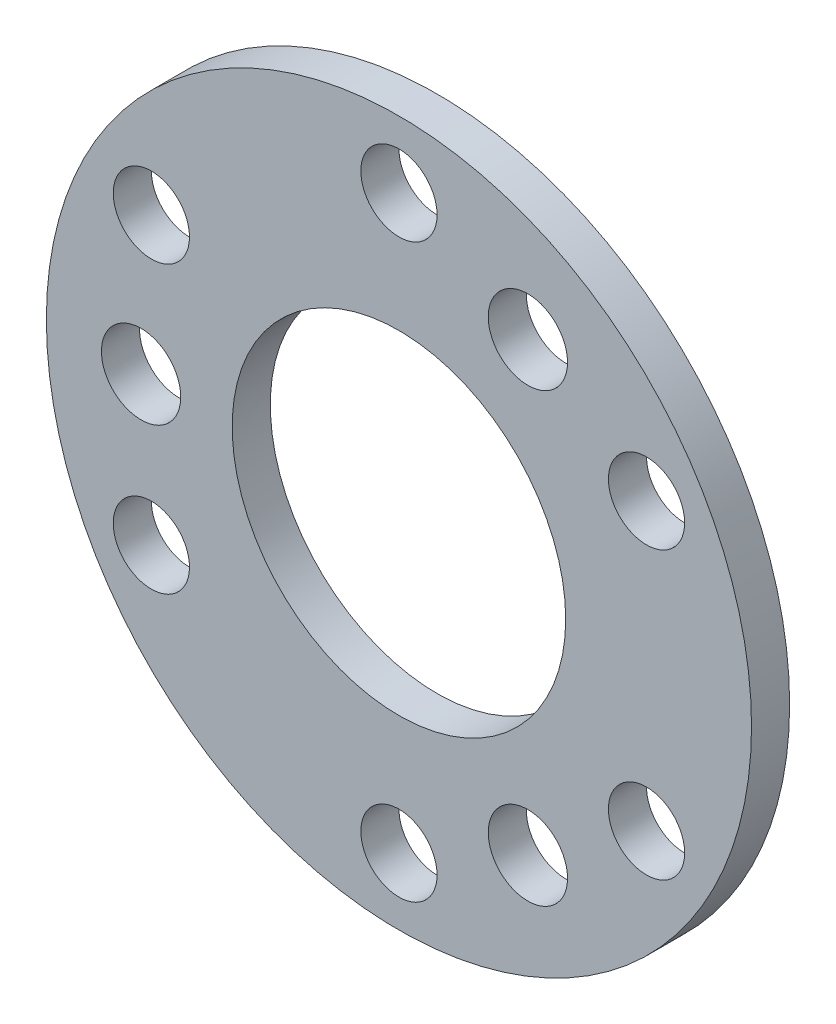
ISO-10303-21;
HEADER;
FILE_DESCRIPTION(('STEP AP214'),'2;1');
FILE_NAME('part.step','',(''),(''),'','','');
FILE_SCHEMA(('AUTOMOTIVE_DESIGN { 1 0 10303 214 1 1 1 1 }'));
ENDSEC;
DATA;
#1=APPLICATION_CONTEXT('core data for automotive mechanical design processes');
#2=APPLICATION_PROTOCOL_DEFINITION('international standard','automotive_design',2000,#1);
#3=PRODUCT_CONTEXT('',#1,'mechanical');
#4=PRODUCT('Part','Part','',(#3));
#5=PRODUCT_RELATED_PRODUCT_CATEGORY('part','',(#4));
#6=PRODUCT_DEFINITION_FORMATION('','',#4);
#7=PRODUCT_DEFINITION_CONTEXT('part definition',#1,'design');
#8=PRODUCT_DEFINITION('design','',#6,#7);
#9=PRODUCT_DEFINITION_SHAPE('','',#8);
#10=(LENGTH_UNIT() NAMED_UNIT(*) SI_UNIT(.MILLI.,.METRE.));
#11=(NAMED_UNIT(*) PLANE_ANGLE_UNIT() SI_UNIT($,.RADIAN.));
#12=(NAMED_UNIT(*) SI_UNIT($,.STERADIAN.) SOLID_ANGLE_UNIT());
#13=UNCERTAINTY_MEASURE_WITH_UNIT(LENGTH_MEASURE(1.E-05),#10,'distance_accuracy_value','');
#14=(GEOMETRIC_REPRESENTATION_CONTEXT(3) GLOBAL_UNCERTAINTY_ASSIGNED_CONTEXT((#13)) GLOBAL_UNIT_ASSIGNED_CONTEXT((#10,
#11,#12)) REPRESENTATION_CONTEXT('',''));
#15=CARTESIAN_POINT('',(0.,0.,0.));
#16=DIRECTION('',(0.,0.,1.));
#17=DIRECTION('',(1.,0.,0.));
#18=AXIS2_PLACEMENT_3D('',#15,#16,#17);
#19=CARTESIAN_POINT('',(-0.985220570796085,0.129022057079611,2.));
#20=DIRECTION('',(0.,0.,1.));
#21=DIRECTION('',(1.,0.,0.));
#22=AXIS2_PLACEMENT_3D('',#19,#20,#21);
#23=PLANE('',#22);
#24=CARTESIAN_POINT('',(5.77977942920397,11.846345770283,2.));
#25=DIRECTION('',(0.,0.,1.));
#26=DIRECTION('',(1.,0.,0.));
#27=AXIS2_PLACEMENT_3D('',#24,#25,#26);
#28=CIRCLE('',#27,2.08);
#29=CARTESIAN_POINT('',(7.85977942920397,11.846345770283,2.));
#30=VERTEX_POINT('',#29);
#31=EDGE_CURVE('E89',#30,#30,#28,.T.);
#32=ORIENTED_EDGE('',*,*,#31,.F.);
#33=EDGE_LOOP('',(#32));
#34=FACE_BOUND('',#33,.T.);
#35=CARTESIAN_POINT('',(12.0051604859704,-7.37097794292054,2.));
#36=DIRECTION('',(0.,0.,1.));
#37=DIRECTION('',(1.,0.,0.));
#38=AXIS2_PLACEMENT_3D('',#35,#36,#37);
#39=CIRCLE('',#38,2.);
#40=CARTESIAN_POINT('',(14.0051604859704,-7.37097794292054,2.));
#41=VERTEX_POINT('',#40);
#42=EDGE_CURVE('E77',#41,#41,#39,.T.);
#43=ORIENTED_EDGE('',*,*,#42,.F.);
#44=EDGE_LOOP('',(#43));
#45=FACE_BOUND('',#44,.T.);
#46=CARTESIAN_POINT('',(-0.98522057079598,15.1290220570796,2.));
#47=DIRECTION('',(0.,0.,1.));
#48=DIRECTION('',(1.,0.,0.));
#49=AXIS2_PLACEMENT_3D('',#46,#47,#48);
#50=CIRCLE('',#49,2.);
#51=CARTESIAN_POINT('',(1.01477942920402,15.1290220570796,2.));
#52=VERTEX_POINT('',#51);
#53=EDGE_CURVE('E65',#52,#52,#50,.T.);
#54=ORIENTED_EDGE('',*,*,#53,.F.);
#55=EDGE_LOOP('',(#54));
#56=FACE_BOUND('',#55,.T.);
#57=CARTESIAN_POINT('',(-13.9756016275627,-7.37097794292036,2.));
#58=DIRECTION('',(0.,0.,1.));
#59=DIRECTION('',(1.,0.,0.));
#60=AXIS2_PLACEMENT_3D('',#57,#58,#59);
#61=CIRCLE('',#60,2.);
#62=CARTESIAN_POINT('',(-11.9756016275627,-7.37097794292036,2.));
#63=VERTEX_POINT('',#62);
#64=EDGE_CURVE('E53',#63,#63,#61,.T.);
#65=ORIENTED_EDGE('',*,*,#64,.F.);
#66=EDGE_LOOP('',(#65));
#67=FACE_BOUND('',#66,.T.);
#68=CARTESIAN_POINT('',(-0.985220570796085,-14.8709779429204,2.));
#69=DIRECTION('',(0.,0.,1.));
#70=DIRECTION('',(1.,0.,0.));
#71=AXIS2_PLACEMENT_3D('',#68,#69,#70);
#72=CIRCLE('',#71,2.);
#73=CARTESIAN_POINT('',(1.01477942920391,-14.8709779429204,2.));
#74=VERTEX_POINT('',#73);
#75=EDGE_CURVE('E42',#74,#74,#72,.T.);
#76=ORIENTED_EDGE('',*,*,#75,.F.);
#77=EDGE_LOOP('',(#76));
#78=FACE_BOUND('',#77,.T.);
#79=CARTESIAN_POINT('',(-0.985220570796085,0.129022057079611,2.));
#80=DIRECTION('',(0.,0.,1.));
#81=DIRECTION('',(1.,0.,0.));
#82=AXIS2_PLACEMENT_3D('',#79,#80,#81);
#83=CIRCLE('',#82,18.5);
#84=CARTESIAN_POINT('',(17.5147794292039,0.129022057079611,2.));
#85=VERTEX_POINT('',#84);
#86=EDGE_CURVE('E10',#85,#85,#83,.T.);
#87=ORIENTED_EDGE('',*,*,#86,.T.);
#88=EDGE_LOOP('',(#87));
#89=FACE_BOUND('',#88,.T.);
#90=CARTESIAN_POINT('',(-14.5152205707961,0.129022057079611,2.));
#91=DIRECTION('',(0.,0.,1.));
#92=DIRECTION('',(1.,0.,0.));
#93=AXIS2_PLACEMENT_3D('',#90,#91,#92);
#94=CIRCLE('',#93,2.08);
#95=CARTESIAN_POINT('',(-12.4352205707961,0.129022057079611,2.));
#96=VERTEX_POINT('',#95);
#97=EDGE_CURVE('E47',#96,#96,#94,.T.);
#98=ORIENTED_EDGE('',*,*,#97,.F.);
#99=EDGE_LOOP('',(#98));
#100=FACE_BOUND('',#99,.T.);
#101=CARTESIAN_POINT('',(-13.9756016275626,7.62902205707967,2.));
#102=DIRECTION('',(0.,0.,1.));
#103=DIRECTION('',(1.,0.,0.));
#104=AXIS2_PLACEMENT_3D('',#101,#102,#103);
#105=CIRCLE('',#104,2.);
#106=CARTESIAN_POINT('',(-11.9756016275626,7.62902205707967,2.));
#107=VERTEX_POINT('',#106);
#108=EDGE_CURVE('E59',#107,#107,#105,.T.);
#109=ORIENTED_EDGE('',*,*,#108,.F.);
#110=EDGE_LOOP('',(#109));
#111=FACE_BOUND('',#110,.T.);
#112=CARTESIAN_POINT('',(12.0051604859706,7.62902205707949,2.));
#113=DIRECTION('',(0.,0.,1.));
#114=DIRECTION('',(1.,0.,0.));
#115=AXIS2_PLACEMENT_3D('',#112,#113,#114);
#116=CIRCLE('',#115,2.);
#117=CARTESIAN_POINT('',(14.0051604859706,7.62902205707949,2.));
#118=VERTEX_POINT('',#117);
#119=EDGE_CURVE('E71',#118,#118,#116,.T.);
#120=ORIENTED_EDGE('',*,*,#119,.F.);
#121=EDGE_LOOP('',(#120));
#122=FACE_BOUND('',#121,.T.);
#123=CARTESIAN_POINT('',(-0.985220570796085,0.129022057079611,2.));
#124=DIRECTION('',(0.,0.,1.));
#125=DIRECTION('',(1.,0.,0.));
#126=AXIS2_PLACEMENT_3D('',#123,#124,#125);
#127=CIRCLE('',#126,8.75);
#128=CARTESIAN_POINT('',(7.76477942920392,0.129022057079611,2.));
#129=VERTEX_POINT('',#128);
#130=EDGE_CURVE('E83',#129,#129,#127,.T.);
#131=ORIENTED_EDGE('',*,*,#130,.F.);
#132=EDGE_LOOP('',(#131));
#133=FACE_BOUND('',#132,.T.);
#134=CARTESIAN_POINT('',(5.77977942920381,-11.5883016561239,2.));
#135=DIRECTION('',(0.,0.,1.));
#136=DIRECTION('',(1.,0.,0.));
#137=AXIS2_PLACEMENT_3D('',#134,#135,#136);
#138=CIRCLE('',#137,2.08);
#139=CARTESIAN_POINT('',(7.85977942920381,-11.5883016561239,2.));
#140=VERTEX_POINT('',#139);
#141=EDGE_CURVE('E95',#140,#140,#138,.T.);
#142=ORIENTED_EDGE('',*,*,#141,.F.);
#143=EDGE_LOOP('',(#142));
#144=FACE_BOUND('',#143,.T.);
#145=ADVANCED_FACE('F31',(#34,#45,#56,#67,#78,#89,#100,#111,#122,#133,#144),#23,.T.);
#146=CARTESIAN_POINT('',(-0.985220570796085,0.129022057079611,0.));
#147=DIRECTION('',(0.,0.,1.));
#148=DIRECTION('',(1.,0.,0.));
#149=AXIS2_PLACEMENT_3D('',#146,#147,#148);
#150=PLANE('',#149);
#151=CARTESIAN_POINT('',(-0.985220570796085,0.129022057079611,0.));
#152=DIRECTION('',(0.,0.,1.));
#153=DIRECTION('',(1.,0.,0.));
#154=AXIS2_PLACEMENT_3D('',#151,#152,#153);
#155=CIRCLE('',#154,18.5);
#156=CARTESIAN_POINT('',(17.5147794292039,0.129022057079611,0.));
#157=VERTEX_POINT('',#156);
#158=EDGE_CURVE('E35',#157,#157,#155,.T.);
#159=ORIENTED_EDGE('',*,*,#158,.F.);
#160=EDGE_LOOP('',(#159));
#161=FACE_BOUND('',#160,.T.);
#162=CARTESIAN_POINT('',(-0.985220570796085,-14.8709779429204,0.));
#163=DIRECTION('',(0.,0.,1.));
#164=DIRECTION('',(1.,0.,0.));
#165=AXIS2_PLACEMENT_3D('',#162,#163,#164);
#166=CIRCLE('',#165,2.);
#167=CARTESIAN_POINT('',(1.01477942920391,-14.8709779429204,0.));
#168=VERTEX_POINT('',#167);
#169=EDGE_CURVE('E44',#168,#168,#166,.T.);
#170=ORIENTED_EDGE('',*,*,#169,.T.);
#171=EDGE_LOOP('',(#170));
#172=FACE_BOUND('',#171,.T.);
#173=CARTESIAN_POINT('',(-14.5152205707961,0.129022057079611,0.));
#174=DIRECTION('',(0.,0.,1.));
#175=DIRECTION('',(1.,0.,0.));
#176=AXIS2_PLACEMENT_3D('',#173,#174,#175);
#177=CIRCLE('',#176,2.08);
#178=CARTESIAN_POINT('',(-12.4352205707961,0.129022057079611,0.));
#179=VERTEX_POINT('',#178);
#180=EDGE_CURVE('E50',#179,#179,#177,.T.);
#181=ORIENTED_EDGE('',*,*,#180,.T.);
#182=EDGE_LOOP('',(#181));
#183=FACE_BOUND('',#182,.T.);
#184=CARTESIAN_POINT('',(-13.9756016275627,-7.37097794292036,0.));
#185=DIRECTION('',(0.,0.,1.));
#186=DIRECTION('',(1.,0.,0.));
#187=AXIS2_PLACEMENT_3D('',#184,#185,#186);
#188=CIRCLE('',#187,2.);
#189=CARTESIAN_POINT('',(-11.9756016275627,-7.37097794292036,0.));
#190=VERTEX_POINT('',#189);
#191=EDGE_CURVE('E56',#190,#190,#188,.T.);
#192=ORIENTED_EDGE('',*,*,#191,.T.);
#193=EDGE_LOOP('',(#192));
#194=FACE_BOUND('',#193,.T.);
#195=CARTESIAN_POINT('',(-13.9756016275626,7.62902205707967,0.));
#196=DIRECTION('',(0.,0.,1.));
#197=DIRECTION('',(1.,0.,0.));
#198=AXIS2_PLACEMENT_3D('',#195,#196,#197);
#199=CIRCLE('',#198,2.);
#200=CARTESIAN_POINT('',(-11.9756016275626,7.62902205707967,0.));
#201=VERTEX_POINT('',#200);
#202=EDGE_CURVE('E62',#201,#201,#199,.T.);
#203=ORIENTED_EDGE('',*,*,#202,.T.);
#204=EDGE_LOOP('',(#203));
#205=FACE_BOUND('',#204,.T.);
#206=CARTESIAN_POINT('',(-0.98522057079598,15.1290220570796,0.));
#207=DIRECTION('',(0.,0.,1.));
#208=DIRECTION('',(1.,0.,0.));
#209=AXIS2_PLACEMENT_3D('',#206,#207,#208);
#210=CIRCLE('',#209,2.);
#211=CARTESIAN_POINT('',(1.01477942920402,15.1290220570796,0.));
#212=VERTEX_POINT('',#211);
#213=EDGE_CURVE('E68',#212,#212,#210,.T.);
#214=ORIENTED_EDGE('',*,*,#213,.T.);
#215=EDGE_LOOP('',(#214));
#216=FACE_BOUND('',#215,.T.);
#217=CARTESIAN_POINT('',(12.0051604859706,7.62902205707949,0.));
#218=DIRECTION('',(0.,0.,1.));
#219=DIRECTION('',(1.,0.,0.));
#220=AXIS2_PLACEMENT_3D('',#217,#218,#219);
#221=CIRCLE('',#220,2.);
#222=CARTESIAN_POINT('',(14.0051604859706,7.62902205707949,0.));
#223=VERTEX_POINT('',#222);
#224=EDGE_CURVE('E74',#223,#223,#221,.T.);
#225=ORIENTED_EDGE('',*,*,#224,.T.);
#226=EDGE_LOOP('',(#225));
#227=FACE_BOUND('',#226,.T.);
#228=CARTESIAN_POINT('',(12.0051604859704,-7.37097794292054,0.));
#229=DIRECTION('',(0.,0.,1.));
#230=DIRECTION('',(1.,0.,0.));
#231=AXIS2_PLACEMENT_3D('',#228,#229,#230);
#232=CIRCLE('',#231,2.);
#233=CARTESIAN_POINT('',(14.0051604859704,-7.37097794292054,0.));
#234=VERTEX_POINT('',#233);
#235=EDGE_CURVE('E80',#234,#234,#232,.T.);
#236=ORIENTED_EDGE('',*,*,#235,.T.);
#237=EDGE_LOOP('',(#236));
#238=FACE_BOUND('',#237,.T.);
#239=CARTESIAN_POINT('',(-0.985220570796085,0.129022057079611,0.));
#240=DIRECTION('',(0.,0.,1.));
#241=DIRECTION('',(1.,0.,0.));
#242=AXIS2_PLACEMENT_3D('',#239,#240,#241);
#243=CIRCLE('',#242,8.75);
#244=CARTESIAN_POINT('',(7.76477942920392,0.129022057079611,0.));
#245=VERTEX_POINT('',#244);
#246=EDGE_CURVE('E86',#245,#245,#243,.T.);
#247=ORIENTED_EDGE('',*,*,#246,.T.);
#248=EDGE_LOOP('',(#247));
#249=FACE_BOUND('',#248,.T.);
#250=CARTESIAN_POINT('',(5.77977942920397,11.846345770283,0.));
#251=DIRECTION('',(0.,0.,1.));
#252=DIRECTION('',(1.,0.,0.));
#253=AXIS2_PLACEMENT_3D('',#250,#251,#252);
#254=CIRCLE('',#253,2.08);
#255=CARTESIAN_POINT('',(7.85977942920397,11.846345770283,0.));
#256=VERTEX_POINT('',#255);
#257=EDGE_CURVE('E92',#256,#256,#254,.T.);
#258=ORIENTED_EDGE('',*,*,#257,.T.);
#259=EDGE_LOOP('',(#258));
#260=FACE_BOUND('',#259,.T.);
#261=CARTESIAN_POINT('',(5.77977942920381,-11.5883016561239,0.));
#262=DIRECTION('',(0.,0.,1.));
#263=DIRECTION('',(1.,0.,0.));
#264=AXIS2_PLACEMENT_3D('',#261,#262,#263);
#265=CIRCLE('',#264,2.08);
#266=CARTESIAN_POINT('',(7.85977942920381,-11.5883016561239,0.));
#267=VERTEX_POINT('',#266);
#268=EDGE_CURVE('E98',#267,#267,#265,.T.);
#269=ORIENTED_EDGE('',*,*,#268,.T.);
#270=EDGE_LOOP('',(#269));
#271=FACE_BOUND('',#270,.T.);
#272=ADVANCED_FACE('F108',(#161,#172,#183,#194,#205,#216,#227,#238,#249,#260,#271),#150,.F.);
#273=CARTESIAN_POINT('',(-0.985220570796085,0.129022057079611,2.));
#274=DIRECTION('',(0.,0.,-1.));
#275=DIRECTION('',(-1.,0.,0.));
#276=AXIS2_PLACEMENT_3D('',#273,#274,#275);
#277=CYLINDRICAL_SURFACE('',#276,18.5);
#278=ORIENTED_EDGE('',*,*,#86,.F.);
#279=EDGE_LOOP('',(#278));
#280=FACE_BOUND('',#279,.T.);
#281=ORIENTED_EDGE('',*,*,#158,.T.);
#282=EDGE_LOOP('',(#281));
#283=FACE_BOUND('',#282,.T.);
#284=ADVANCED_FACE('F33',(#280,#283),#277,.T.);
#285=CARTESIAN_POINT('',(-0.985220570796085,-14.8709779429204,2.));
#286=DIRECTION('',(0.,0.,-1.));
#287=DIRECTION('',(-1.,0.,0.));
#288=AXIS2_PLACEMENT_3D('',#285,#286,#287);
#289=CYLINDRICAL_SURFACE('',#288,2.);
#290=ORIENTED_EDGE('',*,*,#75,.T.);
#291=EDGE_LOOP('',(#290));
#292=FACE_BOUND('',#291,.T.);
#293=ORIENTED_EDGE('',*,*,#169,.F.);
#294=EDGE_LOOP('',(#293));
#295=FACE_BOUND('',#294,.T.);
#296=ADVANCED_FACE('F118',(#292,#295),#289,.F.);
#297=CARTESIAN_POINT('',(-14.5152205707961,0.129022057079611,2.));
#298=DIRECTION('',(0.,0.,-1.));
#299=DIRECTION('',(-1.,0.,0.));
#300=AXIS2_PLACEMENT_3D('',#297,#298,#299);
#301=CYLINDRICAL_SURFACE('',#300,2.08);
#302=ORIENTED_EDGE('',*,*,#97,.T.);
#303=EDGE_LOOP('',(#302));
#304=FACE_BOUND('',#303,.T.);
#305=ORIENTED_EDGE('',*,*,#180,.F.);
#306=EDGE_LOOP('',(#305));
#307=FACE_BOUND('',#306,.T.);
#308=ADVANCED_FACE('F121',(#304,#307),#301,.F.);
#309=CARTESIAN_POINT('',(-13.9756016275627,-7.37097794292036,2.));
#310=DIRECTION('',(0.,0.,-1.));
#311=DIRECTION('',(-1.,0.,0.));
#312=AXIS2_PLACEMENT_3D('',#309,#310,#311);
#313=CYLINDRICAL_SURFACE('',#312,2.);
#314=ORIENTED_EDGE('',*,*,#64,.T.);
#315=EDGE_LOOP('',(#314));
#316=FACE_BOUND('',#315,.T.);
#317=ORIENTED_EDGE('',*,*,#191,.F.);
#318=EDGE_LOOP('',(#317));
#319=FACE_BOUND('',#318,.T.);
#320=ADVANCED_FACE('F125',(#316,#319),#313,.F.);
#321=CARTESIAN_POINT('',(-13.9756016275626,7.62902205707967,2.));
#322=DIRECTION('',(0.,0.,-1.));
#323=DIRECTION('',(-1.,0.,0.));
#324=AXIS2_PLACEMENT_3D('',#321,#322,#323);
#325=CYLINDRICAL_SURFACE('',#324,2.);
#326=ORIENTED_EDGE('',*,*,#108,.T.);
#327=EDGE_LOOP('',(#326));
#328=FACE_BOUND('',#327,.T.);
#329=ORIENTED_EDGE('',*,*,#202,.F.);
#330=EDGE_LOOP('',(#329));
#331=FACE_BOUND('',#330,.T.);
#332=ADVANCED_FACE('F129',(#328,#331),#325,.F.);
#333=CARTESIAN_POINT('',(-0.98522057079598,15.1290220570796,2.));
#334=DIRECTION('',(0.,0.,-1.));
#335=DIRECTION('',(-1.,0.,0.));
#336=AXIS2_PLACEMENT_3D('',#333,#334,#335);
#337=CYLINDRICAL_SURFACE('',#336,2.);
#338=ORIENTED_EDGE('',*,*,#53,.T.);
#339=EDGE_LOOP('',(#338));
#340=FACE_BOUND('',#339,.T.);
#341=ORIENTED_EDGE('',*,*,#213,.F.);
#342=EDGE_LOOP('',(#341));
#343=FACE_BOUND('',#342,.T.);
#344=ADVANCED_FACE('F133',(#340,#343),#337,.F.);
#345=CARTESIAN_POINT('',(12.0051604859706,7.62902205707949,2.));
#346=DIRECTION('',(0.,0.,-1.));
#347=DIRECTION('',(-1.,0.,0.));
#348=AXIS2_PLACEMENT_3D('',#345,#346,#347);
#349=CYLINDRICAL_SURFACE('',#348,2.);
#350=ORIENTED_EDGE('',*,*,#119,.T.);
#351=EDGE_LOOP('',(#350));
#352=FACE_BOUND('',#351,.T.);
#353=ORIENTED_EDGE('',*,*,#224,.F.);
#354=EDGE_LOOP('',(#353));
#355=FACE_BOUND('',#354,.T.);
#356=ADVANCED_FACE('F137',(#352,#355),#349,.F.);
#357=CARTESIAN_POINT('',(12.0051604859704,-7.37097794292054,2.));
#358=DIRECTION('',(0.,0.,-1.));
#359=DIRECTION('',(-1.,0.,0.));
#360=AXIS2_PLACEMENT_3D('',#357,#358,#359);
#361=CYLINDRICAL_SURFACE('',#360,2.);
#362=ORIENTED_EDGE('',*,*,#42,.T.);
#363=EDGE_LOOP('',(#362));
#364=FACE_BOUND('',#363,.T.);
#365=ORIENTED_EDGE('',*,*,#235,.F.);
#366=EDGE_LOOP('',(#365));
#367=FACE_BOUND('',#366,.T.);
#368=ADVANCED_FACE('F141',(#364,#367),#361,.F.);
#369=CARTESIAN_POINT('',(-0.985220570796085,0.129022057079611,2.));
#370=DIRECTION('',(0.,0.,-1.));
#371=DIRECTION('',(-1.,0.,0.));
#372=AXIS2_PLACEMENT_3D('',#369,#370,#371);
#373=CYLINDRICAL_SURFACE('',#372,8.75);
#374=ORIENTED_EDGE('',*,*,#130,.T.);
#375=EDGE_LOOP('',(#374));
#376=FACE_BOUND('',#375,.T.);
#377=ORIENTED_EDGE('',*,*,#246,.F.);
#378=EDGE_LOOP('',(#377));
#379=FACE_BOUND('',#378,.T.);
#380=ADVANCED_FACE('F145',(#376,#379),#373,.F.);
#381=CARTESIAN_POINT('',(5.77977942920397,11.846345770283,2.));
#382=DIRECTION('',(0.,0.,-1.));
#383=DIRECTION('',(-1.,0.,0.));
#384=AXIS2_PLACEMENT_3D('',#381,#382,#383);
#385=CYLINDRICAL_SURFACE('',#384,2.08);
#386=ORIENTED_EDGE('',*,*,#31,.T.);
#387=EDGE_LOOP('',(#386));
#388=FACE_BOUND('',#387,.T.);
#389=ORIENTED_EDGE('',*,*,#257,.F.);
#390=EDGE_LOOP('',(#389));
#391=FACE_BOUND('',#390,.T.);
#392=ADVANCED_FACE('F149',(#388,#391),#385,.F.);
#393=CARTESIAN_POINT('',(5.77977942920381,-11.5883016561239,2.));
#394=DIRECTION('',(0.,0.,-1.));
#395=DIRECTION('',(-1.,0.,0.));
#396=AXIS2_PLACEMENT_3D('',#393,#394,#395);
#397=CYLINDRICAL_SURFACE('',#396,2.08);
#398=ORIENTED_EDGE('',*,*,#141,.T.);
#399=EDGE_LOOP('',(#398));
#400=FACE_BOUND('',#399,.T.);
#401=ORIENTED_EDGE('',*,*,#268,.F.);
#402=EDGE_LOOP('',(#401));
#403=FACE_BOUND('',#402,.T.);
#404=ADVANCED_FACE('F104',(#400,#403),#397,.F.);
#405=CLOSED_SHELL('',(#145,#272,#284,#296,#308,#320,#332,#344,#356,#368,#380,#392,#404));
#406=MANIFOLD_SOLID_BREP('B2',#405);
#407=ADVANCED_BREP_SHAPE_REPRESENTATION('',(#18,#406),#14);
#408=SHAPE_DEFINITION_REPRESENTATION(#9,#407);
ENDSEC;
END-ISO-10303-21;
